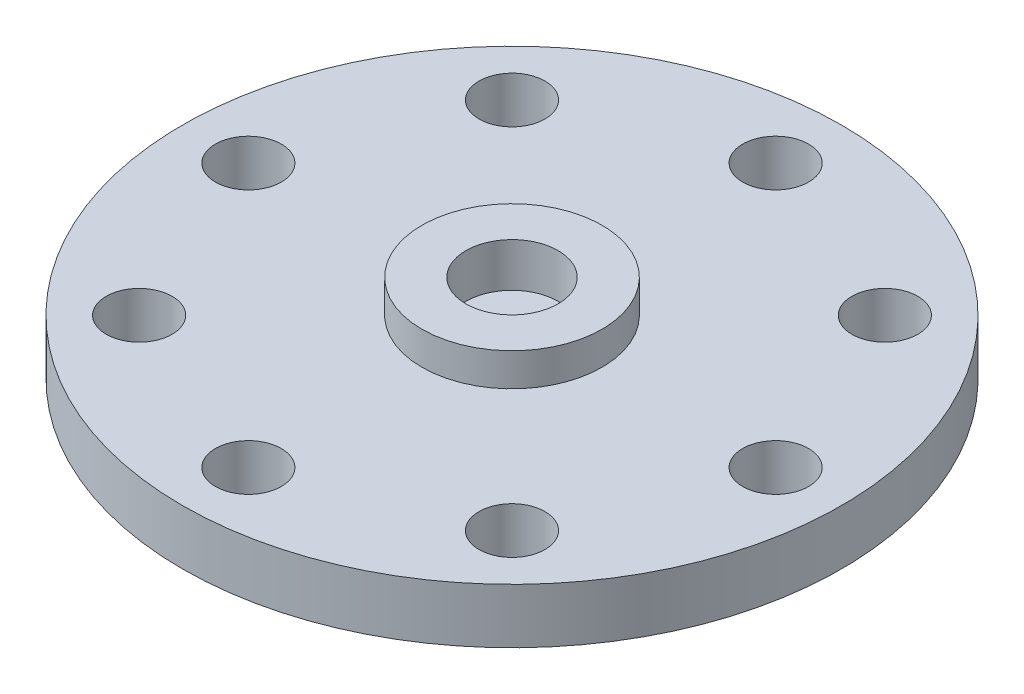
ISO-10303-21;
HEADER;
FILE_DESCRIPTION(('STEP AP214'),'2;1');
FILE_NAME('part.step','',(''),(''),'','','');
FILE_SCHEMA(('AUTOMOTIVE_DESIGN { 1 0 10303 214 1 1 1 1 }'));
ENDSEC;
DATA;
#1=APPLICATION_CONTEXT('core data for automotive mechanical design processes');
#2=APPLICATION_PROTOCOL_DEFINITION('international standard','automotive_design',2000,#1);
#3=PRODUCT_CONTEXT('',#1,'mechanical');
#4=PRODUCT('Part','Part','',(#3));
#5=PRODUCT_RELATED_PRODUCT_CATEGORY('part','',(#4));
#6=PRODUCT_DEFINITION_FORMATION('','',#4);
#7=PRODUCT_DEFINITION_CONTEXT('part definition',#1,'design');
#8=PRODUCT_DEFINITION('design','',#6,#7);
#9=PRODUCT_DEFINITION_SHAPE('','',#8);
#10=(LENGTH_UNIT() NAMED_UNIT(*) SI_UNIT(.MILLI.,.METRE.));
#11=(NAMED_UNIT(*) PLANE_ANGLE_UNIT() SI_UNIT($,.RADIAN.));
#12=(NAMED_UNIT(*) SI_UNIT($,.STERADIAN.) SOLID_ANGLE_UNIT());
#13=UNCERTAINTY_MEASURE_WITH_UNIT(LENGTH_MEASURE(1.E-05),#10,'distance_accuracy_value','');
#14=(GEOMETRIC_REPRESENTATION_CONTEXT(3) GLOBAL_UNCERTAINTY_ASSIGNED_CONTEXT((#13)) GLOBAL_UNIT_ASSIGNED_CONTEXT((#10,
#11,#12)) REPRESENTATION_CONTEXT('',''));
#15=CARTESIAN_POINT('',(0.,0.,0.));
#16=DIRECTION('',(0.,0.,1.));
#17=DIRECTION('',(1.,0.,0.));
#18=AXIS2_PLACEMENT_3D('',#15,#16,#17);
#19=CARTESIAN_POINT('',(-8.44567237582437,4.,-3.81679424676679));
#20=DIRECTION('',(0.,1.,0.));
#21=DIRECTION('',(0.,0.,1.));
#22=AXIS2_PLACEMENT_3D('',#19,#20,#21);
#23=PLANE('',#22);
#24=CARTESIAN_POINT('',(-8.44567237582437,4.,-3.81679424676679));
#25=DIRECTION('',(0.,1.,0.));
#26=DIRECTION('',(0.,0.,1.));
#27=AXIS2_PLACEMENT_3D('',#24,#25,#26);
#28=CIRCLE('',#27,2.1);
#29=CARTESIAN_POINT('',(-8.44567237582437,4.,-1.71679424676679));
#30=VERTEX_POINT('',#29);
#31=EDGE_CURVE('E88',#30,#30,#28,.T.);
#32=ORIENTED_EDGE('',*,*,#31,.F.);
#33=EDGE_LOOP('',(#32));
#34=FACE_BOUND('',#33,.T.);
#35=CARTESIAN_POINT('',(-8.44567237582437,4.,-3.81679424676679));
#36=DIRECTION('',(0.,1.,0.));
#37=DIRECTION('',(0.,0.,1.));
#38=AXIS2_PLACEMENT_3D('',#35,#36,#37);
#39=CIRCLE('',#38,4.1);
#40=CARTESIAN_POINT('',(-8.44567237582437,4.,0.283205753233215));
#41=VERTEX_POINT('',#40);
#42=EDGE_CURVE('E127',#41,#41,#39,.T.);
#43=ORIENTED_EDGE('',*,*,#42,.T.);
#44=EDGE_LOOP('',(#43));
#45=FACE_BOUND('',#44,.T.);
#46=ADVANCED_FACE('F43',(#34,#45),#23,.T.);
#47=CARTESIAN_POINT('',(-8.44567237582437,2.,-3.81679424676679));
#48=DIRECTION('',(0.,1.,0.));
#49=DIRECTION('',(0.,0.,1.));
#50=AXIS2_PLACEMENT_3D('',#47,#48,#49);
#51=CYLINDRICAL_SURFACE('',#50,2.1);
#52=CARTESIAN_POINT('',(-8.44567237582437,2.,-3.81679424676679));
#53=DIRECTION('',(0.,1.,0.));
#54=DIRECTION('',(0.,0.,1.));
#55=AXIS2_PLACEMENT_3D('',#52,#53,#54);
#56=CIRCLE('',#55,2.1);
#57=CARTESIAN_POINT('',(-8.44567237582437,2.,-1.71679424676679));
#58=VERTEX_POINT('',#57);
#59=EDGE_CURVE('E87',#58,#58,#56,.T.);
#60=ORIENTED_EDGE('',*,*,#59,.F.);
#61=EDGE_LOOP('',(#60));
#62=FACE_BOUND('',#61,.T.);
#63=ORIENTED_EDGE('',*,*,#31,.T.);
#64=EDGE_LOOP('',(#63));
#65=FACE_BOUND('',#64,.T.);
#66=ADVANCED_FACE('F178',(#62,#65),#51,.F.);
#67=CARTESIAN_POINT('',(-8.44567237582437,2.,-3.81679424676679));
#68=DIRECTION('',(0.,1.,0.));
#69=DIRECTION('',(0.,0.,1.));
#70=AXIS2_PLACEMENT_3D('',#67,#68,#69);
#71=PLANE('',#70);
#72=ORIENTED_EDGE('',*,*,#59,.T.);
#73=EDGE_LOOP('',(#72));
#74=FACE_BOUND('',#73,.T.);
#75=ADVANCED_FACE('F146',(#74),#71,.T.);
#76=CARTESIAN_POINT('',(-8.44567237582437,2.5,-3.81679424676679));
#77=DIRECTION('',(0.,1.,0.));
#78=DIRECTION('',(0.,0.,1.));
#79=AXIS2_PLACEMENT_3D('',#76,#77,#78);
#80=PLANE('',#79);
#81=CARTESIAN_POINT('',(-8.44567237582437,2.5,-3.81679424676679));
#82=DIRECTION('',(0.,1.,0.));
#83=DIRECTION('',(0.,0.,1.));
#84=AXIS2_PLACEMENT_3D('',#81,#82,#83);
#85=CIRCLE('',#84,4.1);
#86=CARTESIAN_POINT('',(-8.44567237582437,2.5,0.283205753233215));
#87=VERTEX_POINT('',#86);
#88=EDGE_CURVE('E131',#87,#87,#85,.T.);
#89=ORIENTED_EDGE('',*,*,#88,.F.);
#90=EDGE_LOOP('',(#89));
#91=FACE_BOUND('',#90,.T.);
#92=CARTESIAN_POINT('',(-16.9309537500627,2.5,-12.3020756210052));
#93=DIRECTION('',(0.,1.,0.));
#94=DIRECTION('',(0.,0.,1.));
#95=AXIS2_PLACEMENT_3D('',#92,#93,#94);
#96=CIRCLE('',#95,1.5);
#97=CARTESIAN_POINT('',(-16.9309537500627,2.5,-10.8020756210052));
#98=VERTEX_POINT('',#97);
#99=EDGE_CURVE('E47',#98,#98,#96,.T.);
#100=ORIENTED_EDGE('',*,*,#99,.F.);
#101=EDGE_LOOP('',(#100));
#102=FACE_BOUND('',#101,.T.);
#103=CARTESIAN_POINT('',(-20.445672375824,2.5,-3.81679424676657));
#104=DIRECTION('',(0.,1.,0.));
#105=DIRECTION('',(0.,0.,1.));
#106=AXIS2_PLACEMENT_3D('',#103,#104,#105);
#107=CIRCLE('',#106,1.5);
#108=CARTESIAN_POINT('',(-20.445672375824,2.5,-2.31679424676657));
#109=VERTEX_POINT('',#108);
#110=EDGE_CURVE('E123',#109,#109,#107,.T.);
#111=ORIENTED_EDGE('',*,*,#110,.F.);
#112=EDGE_LOOP('',(#111));
#113=FACE_BOUND('',#112,.T.);
#114=CARTESIAN_POINT('',(-16.9309537500624,2.5,4.66848712747195));
#115=DIRECTION('',(0.,1.,0.));
#116=DIRECTION('',(0.,0.,1.));
#117=AXIS2_PLACEMENT_3D('',#114,#115,#116);
#118=CIRCLE('',#117,1.5);
#119=CARTESIAN_POINT('',(-16.9309537500624,2.5,6.16848712747195));
#120=VERTEX_POINT('',#119);
#121=EDGE_CURVE('E119',#120,#120,#118,.T.);
#122=ORIENTED_EDGE('',*,*,#121,.F.);
#123=EDGE_LOOP('',(#122));
#124=FACE_BOUND('',#123,.T.);
#125=CARTESIAN_POINT('',(-8.44567237582378,2.5,8.18320575323321));
#126=DIRECTION('',(0.,1.,0.));
#127=DIRECTION('',(0.,0.,1.));
#128=AXIS2_PLACEMENT_3D('',#125,#126,#127);
#129=CIRCLE('',#128,1.5);
#130=CARTESIAN_POINT('',(-8.44567237582378,2.5,9.68320575323321));
#131=VERTEX_POINT('',#130);
#132=EDGE_CURVE('E115',#131,#131,#129,.T.);
#133=ORIENTED_EDGE('',*,*,#132,.F.);
#134=EDGE_LOOP('',(#133));
#135=FACE_BOUND('',#134,.T.);
#136=CARTESIAN_POINT('',(0.0396089984147328,2.5,4.66848712747159));
#137=DIRECTION('',(0.,1.,0.));
#138=DIRECTION('',(0.,0.,1.));
#139=AXIS2_PLACEMENT_3D('',#136,#137,#138);
#140=CIRCLE('',#139,1.5);
#141=CARTESIAN_POINT('',(0.0396089984147328,2.5,6.16848712747159));
#142=VERTEX_POINT('',#141);
#143=EDGE_CURVE('E111',#142,#142,#140,.T.);
#144=ORIENTED_EDGE('',*,*,#143,.F.);
#145=EDGE_LOOP('',(#144));
#146=FACE_BOUND('',#145,.T.);
#147=CARTESIAN_POINT('',(3.55432762417597,2.5,-3.81679424676708));
#148=DIRECTION('',(0.,1.,0.));
#149=DIRECTION('',(0.,0.,1.));
#150=AXIS2_PLACEMENT_3D('',#147,#148,#149);
#151=CIRCLE('',#150,1.5);
#152=CARTESIAN_POINT('',(3.55432762417597,2.5,-2.31679424676708));
#153=VERTEX_POINT('',#152);
#154=EDGE_CURVE('E107',#153,#153,#151,.T.);
#155=ORIENTED_EDGE('',*,*,#154,.F.);
#156=EDGE_LOOP('',(#155));
#157=FACE_BOUND('',#156,.T.);
#158=CARTESIAN_POINT('',(0.0396089984143165,2.5,-12.3020756210056));
#159=DIRECTION('',(0.,1.,0.));
#160=DIRECTION('',(0.,0.,1.));
#161=AXIS2_PLACEMENT_3D('',#158,#159,#160);
#162=CIRCLE('',#161,1.5);
#163=CARTESIAN_POINT('',(0.0396089984143165,2.5,-10.8020756210056));
#164=VERTEX_POINT('',#163);
#165=EDGE_CURVE('E103',#164,#164,#162,.T.);
#166=ORIENTED_EDGE('',*,*,#165,.F.);
#167=EDGE_LOOP('',(#166));
#168=FACE_BOUND('',#167,.T.);
#169=CARTESIAN_POINT('',(-8.44567237582437,2.5,-15.8167942467668));
#170=DIRECTION('',(0.,1.,0.));
#171=DIRECTION('',(0.,0.,1.));
#172=AXIS2_PLACEMENT_3D('',#169,#170,#171);
#173=CIRCLE('',#172,1.5);
#174=CARTESIAN_POINT('',(-8.44567237582437,2.5,-14.3167942467668));
#175=VERTEX_POINT('',#174);
#176=EDGE_CURVE('E99',#175,#175,#173,.T.);
#177=ORIENTED_EDGE('',*,*,#176,.F.);
#178=EDGE_LOOP('',(#177));
#179=FACE_BOUND('',#178,.T.);
#180=CARTESIAN_POINT('',(-8.44567237582437,2.5,-3.81679424676679));
#181=DIRECTION('',(0.,1.,0.));
#182=DIRECTION('',(0.,0.,1.));
#183=AXIS2_PLACEMENT_3D('',#180,#181,#182);
#184=CIRCLE('',#183,15.);
#185=CARTESIAN_POINT('',(-8.44567237582437,2.5,11.1832057532332));
#186=VERTEX_POINT('',#185);
#187=EDGE_CURVE('E92',#186,#186,#184,.T.);
#188=ORIENTED_EDGE('',*,*,#187,.T.);
#189=EDGE_LOOP('',(#188));
#190=FACE_BOUND('',#189,.T.);
#191=ADVANCED_FACE('F142',(#91,#102,#113,#124,#135,#146,#157,#168,#179,#190),#80,.T.);
#192=CARTESIAN_POINT('',(-8.44567237582437,2.5,-3.81679424676679));
#193=DIRECTION('',(0.,1.,0.));
#194=DIRECTION('',(0.,0.,1.));
#195=AXIS2_PLACEMENT_3D('',#192,#193,#194);
#196=CYLINDRICAL_SURFACE('',#195,4.1);
#197=ORIENTED_EDGE('',*,*,#88,.T.);
#198=EDGE_LOOP('',(#197));
#199=FACE_BOUND('',#198,.T.);
#200=ORIENTED_EDGE('',*,*,#42,.F.);
#201=EDGE_LOOP('',(#200));
#202=FACE_BOUND('',#201,.T.);
#203=ADVANCED_FACE('F145',(#199,#202),#196,.T.);
#204=CARTESIAN_POINT('',(-20.445672375824,4.,-3.81679424676657));
#205=DIRECTION('',(0.,-1.,0.));
#206=DIRECTION('',(0.,0.,-1.));
#207=AXIS2_PLACEMENT_3D('',#204,#205,#206);
#208=CYLINDRICAL_SURFACE('',#207,1.5);
#209=CARTESIAN_POINT('',(-20.445672375824,0.,-3.81679424676657));
#210=DIRECTION('',(0.,1.,0.));
#211=DIRECTION('',(0.,0.,1.));
#212=AXIS2_PLACEMENT_3D('',#209,#210,#211);
#213=CIRCLE('',#212,1.5);
#214=CARTESIAN_POINT('',(-20.445672375824,0.,-2.31679424676657));
#215=VERTEX_POINT('',#214);
#216=EDGE_CURVE('E79',#215,#215,#213,.T.);
#217=ORIENTED_EDGE('',*,*,#216,.F.);
#218=EDGE_LOOP('',(#217));
#219=FACE_BOUND('',#218,.T.);
#220=ORIENTED_EDGE('',*,*,#110,.T.);
#221=EDGE_LOOP('',(#220));
#222=FACE_BOUND('',#221,.T.);
#223=ADVANCED_FACE('F208',(#219,#222),#208,.F.);
#224=CARTESIAN_POINT('',(-16.9309537500624,4.,4.66848712747195));
#225=DIRECTION('',(0.,-1.,0.));
#226=DIRECTION('',(0.,0.,-1.));
#227=AXIS2_PLACEMENT_3D('',#224,#225,#226);
#228=CYLINDRICAL_SURFACE('',#227,1.5);
#229=CARTESIAN_POINT('',(-16.9309537500624,0.,4.66848712747195));
#230=DIRECTION('',(0.,1.,0.));
#231=DIRECTION('',(0.,0.,1.));
#232=AXIS2_PLACEMENT_3D('',#229,#230,#231);
#233=CIRCLE('',#232,1.5);
#234=CARTESIAN_POINT('',(-16.9309537500624,0.,6.16848712747195));
#235=VERTEX_POINT('',#234);
#236=EDGE_CURVE('E75',#235,#235,#233,.T.);
#237=ORIENTED_EDGE('',*,*,#236,.F.);
#238=EDGE_LOOP('',(#237));
#239=FACE_BOUND('',#238,.T.);
#240=ORIENTED_EDGE('',*,*,#121,.T.);
#241=EDGE_LOOP('',(#240));
#242=FACE_BOUND('',#241,.T.);
#243=ADVANCED_FACE('F204',(#239,#242),#228,.F.);
#244=CARTESIAN_POINT('',(-8.44567237582378,4.,8.18320575323321));
#245=DIRECTION('',(0.,-1.,0.));
#246=DIRECTION('',(0.,0.,-1.));
#247=AXIS2_PLACEMENT_3D('',#244,#245,#246);
#248=CYLINDRICAL_SURFACE('',#247,1.5);
#249=CARTESIAN_POINT('',(-8.44567237582378,0.,8.18320575323321));
#250=DIRECTION('',(0.,1.,0.));
#251=DIRECTION('',(0.,0.,1.));
#252=AXIS2_PLACEMENT_3D('',#249,#250,#251);
#253=CIRCLE('',#252,1.5);
#254=CARTESIAN_POINT('',(-8.44567237582378,0.,9.68320575323321));
#255=VERTEX_POINT('',#254);
#256=EDGE_CURVE('E71',#255,#255,#253,.T.);
#257=ORIENTED_EDGE('',*,*,#256,.F.);
#258=EDGE_LOOP('',(#257));
#259=FACE_BOUND('',#258,.T.);
#260=ORIENTED_EDGE('',*,*,#132,.T.);
#261=EDGE_LOOP('',(#260));
#262=FACE_BOUND('',#261,.T.);
#263=ADVANCED_FACE('F200',(#259,#262),#248,.F.);
#264=CARTESIAN_POINT('',(0.0396089984147328,4.,4.66848712747159));
#265=DIRECTION('',(0.,-1.,0.));
#266=DIRECTION('',(0.,0.,-1.));
#267=AXIS2_PLACEMENT_3D('',#264,#265,#266);
#268=CYLINDRICAL_SURFACE('',#267,1.5);
#269=CARTESIAN_POINT('',(0.0396089984147328,0.,4.66848712747159));
#270=DIRECTION('',(0.,1.,0.));
#271=DIRECTION('',(0.,0.,1.));
#272=AXIS2_PLACEMENT_3D('',#269,#270,#271);
#273=CIRCLE('',#272,1.5);
#274=CARTESIAN_POINT('',(0.0396089984147328,0.,6.16848712747159));
#275=VERTEX_POINT('',#274);
#276=EDGE_CURVE('E67',#275,#275,#273,.T.);
#277=ORIENTED_EDGE('',*,*,#276,.F.);
#278=EDGE_LOOP('',(#277));
#279=FACE_BOUND('',#278,.T.);
#280=ORIENTED_EDGE('',*,*,#143,.T.);
#281=EDGE_LOOP('',(#280));
#282=FACE_BOUND('',#281,.T.);
#283=ADVANCED_FACE('F196',(#279,#282),#268,.F.);
#284=CARTESIAN_POINT('',(3.55432762417597,4.,-3.81679424676708));
#285=DIRECTION('',(0.,-1.,0.));
#286=DIRECTION('',(0.,0.,-1.));
#287=AXIS2_PLACEMENT_3D('',#284,#285,#286);
#288=CYLINDRICAL_SURFACE('',#287,1.5);
#289=CARTESIAN_POINT('',(3.55432762417597,0.,-3.81679424676708));
#290=DIRECTION('',(0.,1.,0.));
#291=DIRECTION('',(0.,0.,1.));
#292=AXIS2_PLACEMENT_3D('',#289,#290,#291);
#293=CIRCLE('',#292,1.5);
#294=CARTESIAN_POINT('',(3.55432762417597,0.,-2.31679424676708));
#295=VERTEX_POINT('',#294);
#296=EDGE_CURVE('E63',#295,#295,#293,.T.);
#297=ORIENTED_EDGE('',*,*,#296,.F.);
#298=EDGE_LOOP('',(#297));
#299=FACE_BOUND('',#298,.T.);
#300=ORIENTED_EDGE('',*,*,#154,.T.);
#301=EDGE_LOOP('',(#300));
#302=FACE_BOUND('',#301,.T.);
#303=ADVANCED_FACE('F192',(#299,#302),#288,.F.);
#304=CARTESIAN_POINT('',(0.0396089984143165,4.,-12.3020756210056));
#305=DIRECTION('',(0.,-1.,0.));
#306=DIRECTION('',(0.,0.,-1.));
#307=AXIS2_PLACEMENT_3D('',#304,#305,#306);
#308=CYLINDRICAL_SURFACE('',#307,1.5);
#309=CARTESIAN_POINT('',(0.0396089984143165,0.,-12.3020756210056));
#310=DIRECTION('',(0.,1.,0.));
#311=DIRECTION('',(0.,0.,1.));
#312=AXIS2_PLACEMENT_3D('',#309,#310,#311);
#313=CIRCLE('',#312,1.5);
#314=CARTESIAN_POINT('',(0.0396089984143165,0.,-10.8020756210056));
#315=VERTEX_POINT('',#314);
#316=EDGE_CURVE('E57',#315,#315,#313,.T.);
#317=ORIENTED_EDGE('',*,*,#316,.F.);
#318=EDGE_LOOP('',(#317));
#319=FACE_BOUND('',#318,.T.);
#320=ORIENTED_EDGE('',*,*,#165,.T.);
#321=EDGE_LOOP('',(#320));
#322=FACE_BOUND('',#321,.T.);
#323=ADVANCED_FACE('F174',(#319,#322),#308,.F.);
#324=CARTESIAN_POINT('',(-8.44567237582437,4.,-15.8167942467668));
#325=DIRECTION('',(0.,-1.,0.));
#326=DIRECTION('',(0.,0.,-1.));
#327=AXIS2_PLACEMENT_3D('',#324,#325,#326);
#328=CYLINDRICAL_SURFACE('',#327,1.5);
#329=CARTESIAN_POINT('',(-8.44567237582437,0.,-15.8167942467668));
#330=DIRECTION('',(0.,1.,0.));
#331=DIRECTION('',(0.,0.,1.));
#332=AXIS2_PLACEMENT_3D('',#329,#330,#331);
#333=CIRCLE('',#332,1.5);
#334=CARTESIAN_POINT('',(-8.44567237582437,0.,-14.3167942467668));
#335=VERTEX_POINT('',#334);
#336=EDGE_CURVE('E52',#335,#335,#333,.T.);
#337=ORIENTED_EDGE('',*,*,#336,.F.);
#338=EDGE_LOOP('',(#337));
#339=FACE_BOUND('',#338,.T.);
#340=ORIENTED_EDGE('',*,*,#176,.T.);
#341=EDGE_LOOP('',(#340));
#342=FACE_BOUND('',#341,.T.);
#343=ADVANCED_FACE('F167',(#339,#342),#328,.F.);
#344=CARTESIAN_POINT('',(-8.44567237582437,4.,-3.81679424676679));
#345=DIRECTION('',(0.,-1.,0.));
#346=DIRECTION('',(0.,0.,-1.));
#347=AXIS2_PLACEMENT_3D('',#344,#345,#346);
#348=CYLINDRICAL_SURFACE('',#347,15.);
#349=CARTESIAN_POINT('',(-8.44567237582437,0.,-3.81679424676679));
#350=DIRECTION('',(0.,1.,0.));
#351=DIRECTION('',(0.,0.,1.));
#352=AXIS2_PLACEMENT_3D('',#349,#350,#351);
#353=CIRCLE('',#352,15.);
#354=CARTESIAN_POINT('',(-8.44567237582437,0.,11.1832057532332));
#355=VERTEX_POINT('',#354);
#356=EDGE_CURVE('E10',#355,#355,#353,.T.);
#357=ORIENTED_EDGE('',*,*,#356,.T.);
#358=EDGE_LOOP('',(#357));
#359=FACE_BOUND('',#358,.T.);
#360=ORIENTED_EDGE('',*,*,#187,.F.);
#361=EDGE_LOOP('',(#360));
#362=FACE_BOUND('',#361,.T.);
#363=ADVANCED_FACE('F45',(#359,#362),#348,.T.);
#364=CARTESIAN_POINT('',(-8.44567237582437,0.,-3.81679424676679));
#365=DIRECTION('',(0.,1.,0.));
#366=DIRECTION('',(0.,0.,1.));
#367=AXIS2_PLACEMENT_3D('',#364,#365,#366);
#368=PLANE('',#367);
#369=ORIENTED_EDGE('',*,*,#356,.F.);
#370=EDGE_LOOP('',(#369));
#371=FACE_BOUND('',#370,.T.);
#372=ORIENTED_EDGE('',*,*,#336,.T.);
#373=EDGE_LOOP('',(#372));
#374=FACE_BOUND('',#373,.T.);
#375=ORIENTED_EDGE('',*,*,#316,.T.);
#376=EDGE_LOOP('',(#375));
#377=FACE_BOUND('',#376,.T.);
#378=ORIENTED_EDGE('',*,*,#296,.T.);
#379=EDGE_LOOP('',(#378));
#380=FACE_BOUND('',#379,.T.);
#381=ORIENTED_EDGE('',*,*,#276,.T.);
#382=EDGE_LOOP('',(#381));
#383=FACE_BOUND('',#382,.T.);
#384=ORIENTED_EDGE('',*,*,#256,.T.);
#385=EDGE_LOOP('',(#384));
#386=FACE_BOUND('',#385,.T.);
#387=ORIENTED_EDGE('',*,*,#236,.T.);
#388=EDGE_LOOP('',(#387));
#389=FACE_BOUND('',#388,.T.);
#390=ORIENTED_EDGE('',*,*,#216,.T.);
#391=EDGE_LOOP('',(#390));
#392=FACE_BOUND('',#391,.T.);
#393=CARTESIAN_POINT('',(-16.9309537500627,0.,-12.3020756210052));
#394=DIRECTION('',(0.,1.,0.));
#395=DIRECTION('',(0.,0.,1.));
#396=AXIS2_PLACEMENT_3D('',#393,#394,#395);
#397=CIRCLE('',#396,1.5);
#398=CARTESIAN_POINT('',(-16.9309537500627,0.,-10.8020756210052));
#399=VERTEX_POINT('',#398);
#400=EDGE_CURVE('E83',#399,#399,#397,.T.);
#401=ORIENTED_EDGE('',*,*,#400,.T.);
#402=EDGE_LOOP('',(#401));
#403=FACE_BOUND('',#402,.T.);
#404=ADVANCED_FACE('F166',(#371,#374,#377,#380,#383,#386,#389,#392,#403),#368,.F.);
#405=CARTESIAN_POINT('',(-16.9309537500627,4.,-12.3020756210052));
#406=DIRECTION('',(0.,-1.,0.));
#407=DIRECTION('',(0.,0.,-1.));
#408=AXIS2_PLACEMENT_3D('',#405,#406,#407);
#409=CYLINDRICAL_SURFACE('',#408,1.5);
#410=ORIENTED_EDGE('',*,*,#400,.F.);
#411=EDGE_LOOP('',(#410));
#412=FACE_BOUND('',#411,.T.);
#413=ORIENTED_EDGE('',*,*,#99,.T.);
#414=EDGE_LOOP('',(#413));
#415=FACE_BOUND('',#414,.T.);
#416=ADVANCED_FACE('F140',(#412,#415),#409,.F.);
#417=CLOSED_SHELL('',(#46,#66,#75,#191,#203,#223,#243,#263,#283,#303,#323,#343,#363,#404,#416));
#418=MANIFOLD_SOLID_BREP('B2',#417);
#419=ADVANCED_BREP_SHAPE_REPRESENTATION('',(#18,#418),#14);
#420=SHAPE_DEFINITION_REPRESENTATION(#9,#419);
ENDSEC;
END-ISO-10303-21;
